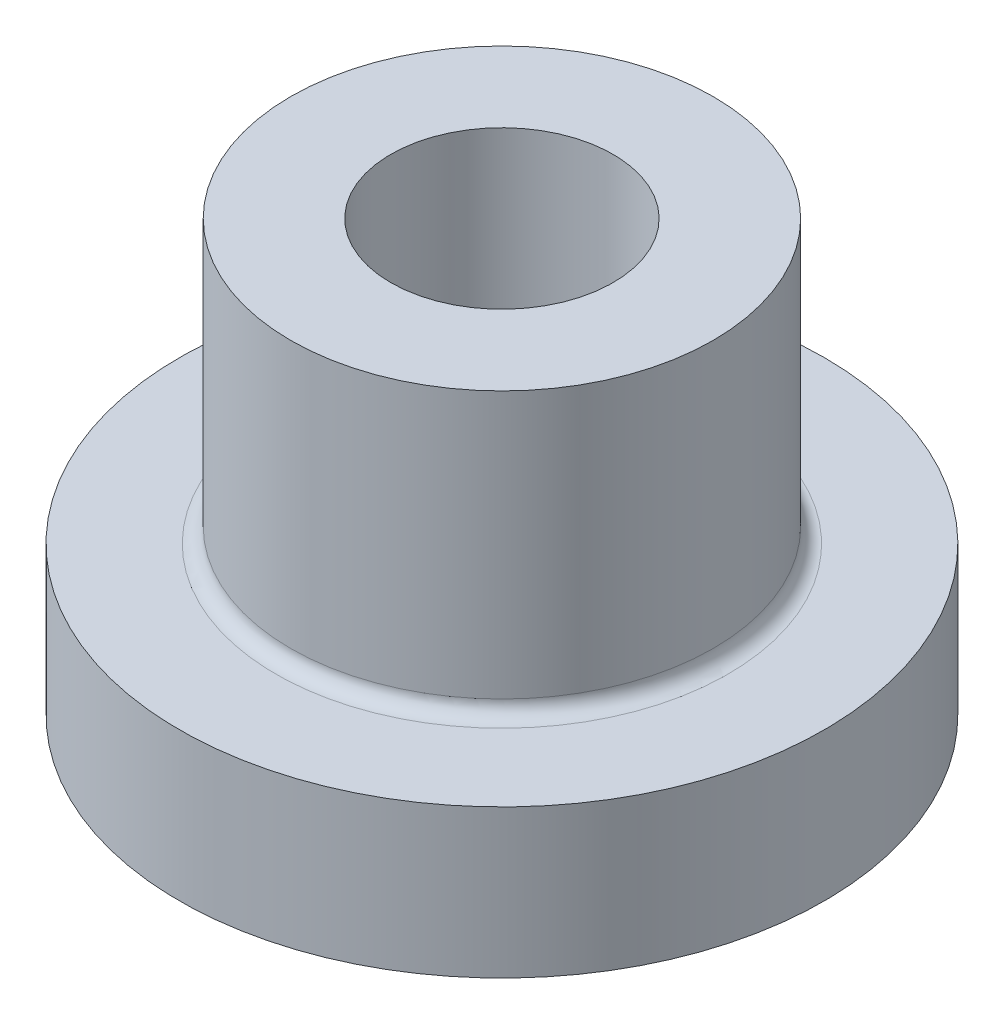
ISO-10303-21;
HEADER;
FILE_DESCRIPTION(('STEP AP214'),'2;1');
FILE_NAME('part.step','',(''),(''),'','','');
FILE_SCHEMA(('AUTOMOTIVE_DESIGN { 1 0 10303 214 1 1 1 1 }'));
ENDSEC;
DATA;
#1=APPLICATION_CONTEXT('core data for automotive mechanical design processes');
#2=APPLICATION_PROTOCOL_DEFINITION('international standard','automotive_design',2000,#1);
#3=PRODUCT_CONTEXT('',#1,'mechanical');
#4=PRODUCT('Part','Part','',(#3));
#5=PRODUCT_RELATED_PRODUCT_CATEGORY('part','',(#4));
#6=PRODUCT_DEFINITION_FORMATION('','',#4);
#7=PRODUCT_DEFINITION_CONTEXT('part definition',#1,'design');
#8=PRODUCT_DEFINITION('design','',#6,#7);
#9=PRODUCT_DEFINITION_SHAPE('','',#8);
#10=(LENGTH_UNIT() NAMED_UNIT(*) SI_UNIT(.MILLI.,.METRE.));
#11=(NAMED_UNIT(*) PLANE_ANGLE_UNIT() SI_UNIT($,.RADIAN.));
#12=(NAMED_UNIT(*) SI_UNIT($,.STERADIAN.) SOLID_ANGLE_UNIT());
#13=UNCERTAINTY_MEASURE_WITH_UNIT(LENGTH_MEASURE(1.E-05),#10,'distance_accuracy_value','');
#14=(GEOMETRIC_REPRESENTATION_CONTEXT(3) GLOBAL_UNCERTAINTY_ASSIGNED_CONTEXT((#13)) GLOBAL_UNIT_ASSIGNED_CONTEXT((#10,
#11,#12)) REPRESENTATION_CONTEXT('',''));
#15=CARTESIAN_POINT('',(0.,0.,0.));
#16=DIRECTION('',(0.,0.,1.));
#17=DIRECTION('',(1.,0.,0.));
#18=AXIS2_PLACEMENT_3D('',#15,#16,#17);
#19=CARTESIAN_POINT('',(0.,4.2,0.));
#20=DIRECTION('',(0.,-1.,0.));
#21=DIRECTION('',(0.,0.,-1.));
#22=AXIS2_PLACEMENT_3D('',#19,#20,#21);
#23=CYLINDRICAL_SURFACE('',#22,2.85);
#24=CARTESIAN_POINT('',(0.,0.6,0.));
#25=DIRECTION('',(0.,-1.,0.));
#26=DIRECTION('',(0.,0.,-1.));
#27=AXIS2_PLACEMENT_3D('',#24,#25,#26);
#28=CIRCLE('',#27,2.85);
#29=CARTESIAN_POINT('',(0.,0.6,-2.85));
#30=VERTEX_POINT('',#29);
#31=EDGE_CURVE('E56',#30,#30,#28,.F.);
#32=ORIENTED_EDGE('',*,*,#31,.T.);
#33=EDGE_LOOP('',(#32));
#34=FACE_BOUND('',#33,.T.);
#35=CARTESIAN_POINT('',(0.,4.2,0.));
#36=DIRECTION('',(0.,1.,0.));
#37=DIRECTION('',(0.,0.,1.));
#38=AXIS2_PLACEMENT_3D('',#35,#36,#37);
#39=CIRCLE('',#38,2.85);
#40=CARTESIAN_POINT('',(0.,4.2,2.85));
#41=VERTEX_POINT('',#40);
#42=EDGE_CURVE('E67',#41,#41,#39,.T.);
#43=ORIENTED_EDGE('',*,*,#42,.F.);
#44=EDGE_LOOP('',(#43));
#45=FACE_BOUND('',#44,.T.);
#46=ADVANCED_FACE('F43',(#34,#45),#23,.T.);
#47=CARTESIAN_POINT('',(0.,4.2,0.));
#48=DIRECTION('',(0.,1.,0.));
#49=DIRECTION('',(0.,0.,1.));
#50=AXIS2_PLACEMENT_3D('',#47,#48,#49);
#51=PLANE('',#50);
#52=CARTESIAN_POINT('',(0.,4.2,0.));
#53=DIRECTION('',(0.,1.,0.));
#54=DIRECTION('',(0.,0.,1.));
#55=AXIS2_PLACEMENT_3D('',#52,#53,#54);
#56=CIRCLE('',#55,1.5);
#57=CARTESIAN_POINT('',(0.,4.2,1.5));
#58=VERTEX_POINT('',#57);
#59=EDGE_CURVE('E71',#58,#58,#56,.T.);
#60=ORIENTED_EDGE('',*,*,#59,.F.);
#61=EDGE_LOOP('',(#60));
#62=FACE_BOUND('',#61,.T.);
#63=ORIENTED_EDGE('',*,*,#42,.T.);
#64=EDGE_LOOP('',(#63));
#65=FACE_BOUND('',#64,.T.);
#66=ADVANCED_FACE('F110',(#62,#65),#51,.T.);
#67=CARTESIAN_POINT('',(0.,0.,0.));
#68=DIRECTION('',(0.,1.,0.));
#69=DIRECTION('',(0.,0.,1.));
#70=AXIS2_PLACEMENT_3D('',#67,#68,#69);
#71=PLANE('',#70);
#72=CARTESIAN_POINT('',(0.,0.,0.));
#73=DIRECTION('',(0.,1.,0.));
#74=DIRECTION('',(0.,0.,1.));
#75=AXIS2_PLACEMENT_3D('',#72,#73,#74);
#76=CIRCLE('',#75,2.65);
#77=CARTESIAN_POINT('',(0.,0.,2.65));
#78=VERTEX_POINT('',#77);
#79=EDGE_CURVE('E10',#78,#78,#76,.F.);
#80=ORIENTED_EDGE('',*,*,#79,.T.);
#81=EDGE_LOOP('',(#80));
#82=FACE_BOUND('',#81,.T.);
#83=CARTESIAN_POINT('',(0.,0.,0.));
#84=DIRECTION('',(0.,1.,0.));
#85=DIRECTION('',(0.,0.,1.));
#86=AXIS2_PLACEMENT_3D('',#83,#84,#85);
#87=CIRCLE('',#86,1.5);
#88=CARTESIAN_POINT('',(0.,0.,1.5));
#89=VERTEX_POINT('',#88);
#90=EDGE_CURVE('E72',#89,#89,#87,.T.);
#91=ORIENTED_EDGE('',*,*,#90,.T.);
#92=EDGE_LOOP('',(#91));
#93=FACE_BOUND('',#92,.T.);
#94=ADVANCED_FACE('F116',(#82,#93),#71,.F.);
#95=CARTESIAN_POINT('',(0.,4.2,0.));
#96=DIRECTION('',(0.,-1.,0.));
#97=DIRECTION('',(0.,0.,-1.));
#98=AXIS2_PLACEMENT_3D('',#95,#96,#97);
#99=CYLINDRICAL_SURFACE('',#98,1.5);
#100=ORIENTED_EDGE('',*,*,#59,.T.);
#101=EDGE_LOOP('',(#100));
#102=FACE_BOUND('',#101,.T.);
#103=ORIENTED_EDGE('',*,*,#90,.F.);
#104=EDGE_LOOP('',(#103));
#105=FACE_BOUND('',#104,.T.);
#106=ADVANCED_FACE('F122',(#102,#105),#99,.F.);
#107=CARTESIAN_POINT('',(0.,0.4,0.));
#108=DIRECTION('',(0.,-1.,0.));
#109=DIRECTION('',(0.,0.,-1.));
#110=AXIS2_PLACEMENT_3D('',#107,#108,#109);
#111=CYLINDRICAL_SURFACE('',#110,2.85);
#112=CARTESIAN_POINT('',(0.,-0.2,0.));
#113=DIRECTION('',(0.,1.,0.));
#114=DIRECTION('',(0.,0.,1.));
#115=AXIS2_PLACEMENT_3D('',#112,#113,#114);
#116=CIRCLE('',#115,2.85);
#117=CARTESIAN_POINT('',(0.,-0.2,2.85));
#118=VERTEX_POINT('',#117);
#119=EDGE_CURVE('E51',#118,#118,#116,.T.);
#120=ORIENTED_EDGE('',*,*,#119,.T.);
#121=EDGE_LOOP('',(#120));
#122=FACE_BOUND('',#121,.T.);
#123=CARTESIAN_POINT('',(0.,-1.6,0.));
#124=DIRECTION('',(0.,-1.,0.));
#125=DIRECTION('',(0.,0.,-1.));
#126=AXIS2_PLACEMENT_3D('',#123,#124,#125);
#127=CIRCLE('',#126,2.85);
#128=CARTESIAN_POINT('',(0.,-1.6,-2.85));
#129=VERTEX_POINT('',#128);
#130=EDGE_CURVE('E87',#129,#129,#127,.T.);
#131=ORIENTED_EDGE('',*,*,#130,.T.);
#132=EDGE_LOOP('',(#131));
#133=FACE_BOUND('',#132,.T.);
#134=ADVANCED_FACE('F92',(#122,#133),#111,.F.);
#135=CARTESIAN_POINT('',(0.,0.4,0.));
#136=DIRECTION('',(0.,-1.,0.));
#137=DIRECTION('',(0.,0.,-1.));
#138=AXIS2_PLACEMENT_3D('',#135,#136,#137);
#139=CYLINDRICAL_SURFACE('',#138,4.35);
#140=CARTESIAN_POINT('',(0.,0.4,0.));
#141=DIRECTION('',(0.,-1.,0.));
#142=DIRECTION('',(0.,0.,-1.));
#143=AXIS2_PLACEMENT_3D('',#140,#141,#142);
#144=CIRCLE('',#143,4.35);
#145=CARTESIAN_POINT('',(0.,0.4,-4.35));
#146=VERTEX_POINT('',#145);
#147=EDGE_CURVE('E76',#146,#146,#144,.T.);
#148=ORIENTED_EDGE('',*,*,#147,.T.);
#149=EDGE_LOOP('',(#148));
#150=FACE_BOUND('',#149,.T.);
#151=CARTESIAN_POINT('',(0.,-1.6,0.));
#152=DIRECTION('',(0.,-1.,0.));
#153=DIRECTION('',(0.,0.,-1.));
#154=AXIS2_PLACEMENT_3D('',#151,#152,#153);
#155=CIRCLE('',#154,4.35);
#156=CARTESIAN_POINT('',(0.,-1.6,-4.35));
#157=VERTEX_POINT('',#156);
#158=EDGE_CURVE('E83',#157,#157,#155,.T.);
#159=ORIENTED_EDGE('',*,*,#158,.F.);
#160=EDGE_LOOP('',(#159));
#161=FACE_BOUND('',#160,.T.);
#162=ADVANCED_FACE('F105',(#150,#161),#139,.T.);
#163=CARTESIAN_POINT('',(0.,0.4,0.));
#164=DIRECTION('',(0.,-1.,0.));
#165=DIRECTION('',(0.,0.,-1.));
#166=AXIS2_PLACEMENT_3D('',#163,#164,#165);
#167=PLANE('',#166);
#168=CARTESIAN_POINT('',(0.,0.4,0.));
#169=DIRECTION('',(0.,-1.,0.));
#170=DIRECTION('',(0.,0.,-1.));
#171=AXIS2_PLACEMENT_3D('',#168,#169,#170);
#172=CIRCLE('',#171,3.05);
#173=CARTESIAN_POINT('',(0.,0.4,-3.05));
#174=VERTEX_POINT('',#173);
#175=EDGE_CURVE('E61',#174,#174,#172,.T.);
#176=ORIENTED_EDGE('',*,*,#175,.T.);
#177=EDGE_LOOP('',(#176));
#178=FACE_BOUND('',#177,.T.);
#179=ORIENTED_EDGE('',*,*,#147,.F.);
#180=EDGE_LOOP('',(#179));
#181=FACE_BOUND('',#180,.T.);
#182=ADVANCED_FACE('F97',(#178,#181),#167,.F.);
#183=CARTESIAN_POINT('',(0.,-1.6,0.));
#184=DIRECTION('',(0.,-1.,0.));
#185=DIRECTION('',(0.,0.,-1.));
#186=AXIS2_PLACEMENT_3D('',#183,#184,#185);
#187=PLANE('',#186);
#188=ORIENTED_EDGE('',*,*,#158,.T.);
#189=EDGE_LOOP('',(#188));
#190=FACE_BOUND('',#189,.T.);
#191=ORIENTED_EDGE('',*,*,#130,.F.);
#192=EDGE_LOOP('',(#191));
#193=FACE_BOUND('',#192,.T.);
#194=ADVANCED_FACE('F94',(#190,#193),#187,.T.);
#195=CARTESIAN_POINT('',(0.,0.6,0.));
#196=DIRECTION('',(0.,-1.,0.));
#197=DIRECTION('',(0.,0.,-1.));
#198=AXIS2_PLACEMENT_3D('',#195,#196,#197);
#199=TOROIDAL_SURFACE('',#198,3.05,0.2);
#200=ORIENTED_EDGE('',*,*,#31,.F.);
#201=EDGE_LOOP('',(#200));
#202=FACE_BOUND('',#201,.T.);
#203=ORIENTED_EDGE('',*,*,#175,.F.);
#204=EDGE_LOOP('',(#203));
#205=FACE_BOUND('',#204,.T.);
#206=ADVANCED_FACE('F96',(#202,#205),#199,.F.);
#207=CARTESIAN_POINT('',(0.,-0.2,0.));
#208=DIRECTION('',(0.,1.,0.));
#209=DIRECTION('',(0.,0.,1.));
#210=AXIS2_PLACEMENT_3D('',#207,#208,#209);
#211=TOROIDAL_SURFACE('',#210,2.65,0.2);
#212=ORIENTED_EDGE('',*,*,#79,.F.);
#213=EDGE_LOOP('',(#212));
#214=FACE_BOUND('',#213,.T.);
#215=ORIENTED_EDGE('',*,*,#119,.F.);
#216=EDGE_LOOP('',(#215));
#217=FACE_BOUND('',#216,.T.);
#218=ADVANCED_FACE('F45',(#214,#217),#211,.F.);
#219=CLOSED_SHELL('',(#46,#66,#94,#106,#134,#162,#182,#194,#206,#218));
#220=MANIFOLD_SOLID_BREP('B2',#219);
#221=ADVANCED_BREP_SHAPE_REPRESENTATION('',(#18,#220),#14);
#222=SHAPE_DEFINITION_REPRESENTATION(#9,#221);
ENDSEC;
END-ISO-10303-21;
